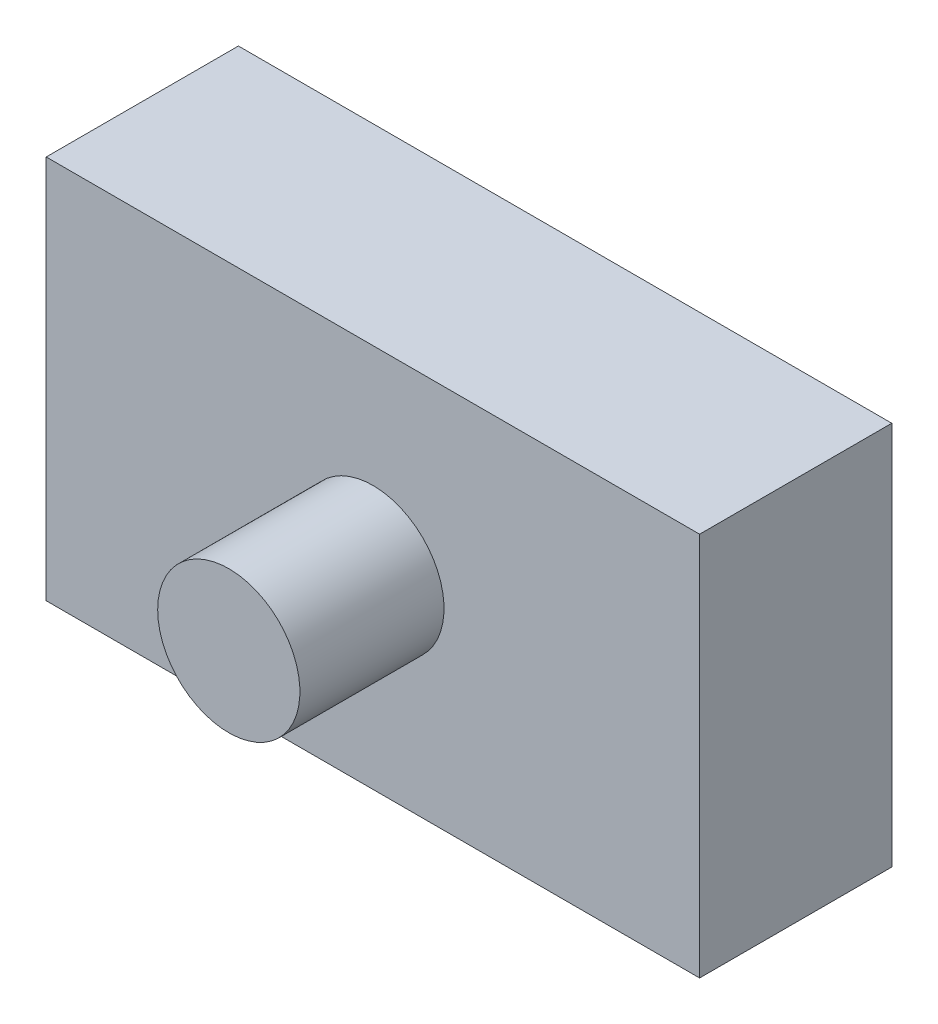
ISO-10303-21;
HEADER;
FILE_DESCRIPTION(('STEP AP214'),'2;1');
FILE_NAME('part.step','',(''),(''),'','','');
FILE_SCHEMA(('AUTOMOTIVE_DESIGN { 1 0 10303 214 1 1 1 1 }'));
ENDSEC;
DATA;
#1=APPLICATION_CONTEXT('core data for automotive mechanical design processes');
#2=APPLICATION_PROTOCOL_DEFINITION('international standard','automotive_design',2000,#1);
#3=PRODUCT_CONTEXT('',#1,'mechanical');
#4=PRODUCT('Part','Part','',(#3));
#5=PRODUCT_RELATED_PRODUCT_CATEGORY('part','',(#4));
#6=PRODUCT_DEFINITION_FORMATION('','',#4);
#7=PRODUCT_DEFINITION_CONTEXT('part definition',#1,'design');
#8=PRODUCT_DEFINITION('design','',#6,#7);
#9=PRODUCT_DEFINITION_SHAPE('','',#8);
#10=(LENGTH_UNIT() NAMED_UNIT(*) SI_UNIT(.MILLI.,.METRE.));
#11=(NAMED_UNIT(*) PLANE_ANGLE_UNIT() SI_UNIT($,.RADIAN.));
#12=(NAMED_UNIT(*) SI_UNIT($,.STERADIAN.) SOLID_ANGLE_UNIT());
#13=UNCERTAINTY_MEASURE_WITH_UNIT(LENGTH_MEASURE(1.E-05),#10,'distance_accuracy_value','');
#14=(GEOMETRIC_REPRESENTATION_CONTEXT(3) GLOBAL_UNCERTAINTY_ASSIGNED_CONTEXT((#13)) GLOBAL_UNIT_ASSIGNED_CONTEXT((#10,
#11,#12)) REPRESENTATION_CONTEXT('',''));
#15=CARTESIAN_POINT('',(0.,0.,0.));
#16=DIRECTION('',(0.,0.,1.));
#17=DIRECTION('',(1.,0.,0.));
#18=AXIS2_PLACEMENT_3D('',#15,#16,#17);
#19=CARTESIAN_POINT('',(21.59,-12.7,-12.7));
#20=DIRECTION('',(1.,0.,0.));
#21=DIRECTION('',(0.,0.,-1.));
#22=AXIS2_PLACEMENT_3D('',#19,#20,#21);
#23=PLANE('',#22);
#24=DIRECTION('',(0.,1.,0.));
#25=VECTOR('',#24,1.);
#26=CARTESIAN_POINT('',(21.59,-12.7,0.));
#27=LINE('',#26,#25);
#28=CARTESIAN_POINT('',(21.59,-12.7,0.));
#29=VERTEX_POINT('',#28);
#30=CARTESIAN_POINT('',(21.59,12.7,0.));
#31=VERTEX_POINT('',#30);
#32=EDGE_CURVE('E111',#29,#31,#27,.T.);
#33=ORIENTED_EDGE('',*,*,#32,.F.);
#34=DIRECTION('',(0.,0.,1.));
#35=VECTOR('',#34,1.);
#36=CARTESIAN_POINT('',(21.59,-12.7,-12.7));
#37=LINE('',#36,#35);
#38=CARTESIAN_POINT('',(21.59,-12.7,-12.7));
#39=VERTEX_POINT('',#38);
#40=EDGE_CURVE('E49',#39,#29,#37,.T.);
#41=ORIENTED_EDGE('',*,*,#40,.F.);
#42=DIRECTION('',(0.,1.,0.));
#43=VECTOR('',#42,1.);
#44=CARTESIAN_POINT('',(21.59,-12.7,-12.7));
#45=LINE('',#44,#43);
#46=CARTESIAN_POINT('',(21.59,12.7,-12.7));
#47=VERTEX_POINT('',#46);
#48=EDGE_CURVE('E103',#39,#47,#45,.T.);
#49=ORIENTED_EDGE('',*,*,#48,.T.);
#50=DIRECTION('',(0.,0.,1.));
#51=VECTOR('',#50,1.);
#52=CARTESIAN_POINT('',(21.59,12.7,-12.7));
#53=LINE('',#52,#51);
#54=EDGE_CURVE('E42',#47,#31,#53,.T.);
#55=ORIENTED_EDGE('',*,*,#54,.T.);
#56=EDGE_LOOP('',(#33,#41,#49,#55));
#57=FACE_BOUND('',#56,.T.);
#58=ADVANCED_FACE('F39',(#57),#23,.T.);
#59=CARTESIAN_POINT('',(-21.59,-12.7,-12.7));
#60=DIRECTION('',(0.,-1.,0.));
#61=DIRECTION('',(0.,0.,-1.));
#62=AXIS2_PLACEMENT_3D('',#59,#60,#61);
#63=PLANE('',#62);
#64=DIRECTION('',(1.,0.,0.));
#65=VECTOR('',#64,1.);
#66=CARTESIAN_POINT('',(-21.59,-12.7,0.));
#67=LINE('',#66,#65);
#68=CARTESIAN_POINT('',(-21.59,-12.7,0.));
#69=VERTEX_POINT('',#68);
#70=EDGE_CURVE('E106',#69,#29,#67,.T.);
#71=ORIENTED_EDGE('',*,*,#70,.F.);
#72=DIRECTION('',(0.,0.,1.));
#73=VECTOR('',#72,1.);
#74=CARTESIAN_POINT('',(-21.59,-12.7,-12.7));
#75=LINE('',#74,#73);
#76=CARTESIAN_POINT('',(-21.59,-12.7,-12.7));
#77=VERTEX_POINT('',#76);
#78=EDGE_CURVE('E74',#77,#69,#75,.T.);
#79=ORIENTED_EDGE('',*,*,#78,.F.);
#80=DIRECTION('',(1.,0.,0.));
#81=VECTOR('',#80,1.);
#82=CARTESIAN_POINT('',(-21.59,-12.7,-12.7));
#83=LINE('',#82,#81);
#84=EDGE_CURVE('E98',#77,#39,#83,.T.);
#85=ORIENTED_EDGE('',*,*,#84,.T.);
#86=ORIENTED_EDGE('',*,*,#40,.T.);
#87=EDGE_LOOP('',(#71,#79,#85,#86));
#88=FACE_BOUND('',#87,.T.);
#89=ADVANCED_FACE('F130',(#88),#63,.T.);
#90=CARTESIAN_POINT('',(-21.59,-12.7,-12.7));
#91=DIRECTION('',(-1.,0.,0.));
#92=DIRECTION('',(0.,0.,1.));
#93=AXIS2_PLACEMENT_3D('',#90,#91,#92);
#94=PLANE('',#93);
#95=DIRECTION('',(0.,-1.,0.));
#96=VECTOR('',#95,1.);
#97=CARTESIAN_POINT('',(-21.59,-12.7,0.));
#98=LINE('',#97,#96);
#99=CARTESIAN_POINT('',(-21.59,12.7,0.));
#100=VERTEX_POINT('',#99);
#101=EDGE_CURVE('E92',#100,#69,#98,.T.);
#102=ORIENTED_EDGE('',*,*,#101,.F.);
#103=DIRECTION('',(0.,0.,1.));
#104=VECTOR('',#103,1.);
#105=CARTESIAN_POINT('',(-21.59,12.7,-12.7));
#106=LINE('',#105,#104);
#107=CARTESIAN_POINT('',(-21.59,12.7,-12.7));
#108=VERTEX_POINT('',#107);
#109=EDGE_CURVE('E87',#108,#100,#106,.T.);
#110=ORIENTED_EDGE('',*,*,#109,.F.);
#111=DIRECTION('',(0.,-1.,0.));
#112=VECTOR('',#111,1.);
#113=CARTESIAN_POINT('',(-21.59,-12.7,-12.7));
#114=LINE('',#113,#112);
#115=EDGE_CURVE('E90',#108,#77,#114,.T.);
#116=ORIENTED_EDGE('',*,*,#115,.T.);
#117=ORIENTED_EDGE('',*,*,#78,.T.);
#118=EDGE_LOOP('',(#102,#110,#116,#117));
#119=FACE_BOUND('',#118,.T.);
#120=ADVANCED_FACE('F89',(#119),#94,.T.);
#121=CARTESIAN_POINT('',(-21.59,12.7,-12.7));
#122=DIRECTION('',(0.,1.,0.));
#123=DIRECTION('',(0.,0.,1.));
#124=AXIS2_PLACEMENT_3D('',#121,#122,#123);
#125=PLANE('',#124);
#126=DIRECTION('',(-1.,0.,0.));
#127=VECTOR('',#126,1.);
#128=CARTESIAN_POINT('',(-21.59,12.7,0.));
#129=LINE('',#128,#127);
#130=EDGE_CURVE('E115',#31,#100,#129,.T.);
#131=ORIENTED_EDGE('',*,*,#130,.F.);
#132=ORIENTED_EDGE('',*,*,#54,.F.);
#133=DIRECTION('',(-1.,0.,0.));
#134=VECTOR('',#133,1.);
#135=CARTESIAN_POINT('',(-21.59,12.7,-12.7));
#136=LINE('',#135,#134);
#137=EDGE_CURVE('E97',#47,#108,#136,.T.);
#138=ORIENTED_EDGE('',*,*,#137,.T.);
#139=ORIENTED_EDGE('',*,*,#109,.T.);
#140=EDGE_LOOP('',(#131,#132,#138,#139));
#141=FACE_BOUND('',#140,.T.);
#142=ADVANCED_FACE('F101',(#141),#125,.T.);
#143=CARTESIAN_POINT('',(0.,0.,-12.7));
#144=DIRECTION('',(0.,0.,-1.));
#145=DIRECTION('',(-1.,0.,0.));
#146=AXIS2_PLACEMENT_3D('',#143,#144,#145);
#147=PLANE('',#146);
#148=ORIENTED_EDGE('',*,*,#48,.F.);
#149=ORIENTED_EDGE('',*,*,#84,.F.);
#150=ORIENTED_EDGE('',*,*,#115,.F.);
#151=ORIENTED_EDGE('',*,*,#137,.F.);
#152=EDGE_LOOP('',(#148,#149,#150,#151));
#153=FACE_BOUND('',#152,.T.);
#154=ADVANCED_FACE('F96',(#153),#147,.T.);
#155=CARTESIAN_POINT('',(0.,0.,0.));
#156=DIRECTION('',(0.,0.,-1.));
#157=DIRECTION('',(-1.,0.,0.));
#158=AXIS2_PLACEMENT_3D('',#155,#156,#157);
#159=PLANE('',#158);
#160=CARTESIAN_POINT('',(0.,0.,0.));
#161=DIRECTION('',(0.,0.,1.));
#162=DIRECTION('',(1.,0.,0.));
#163=AXIS2_PLACEMENT_3D('',#160,#161,#162);
#164=CIRCLE('',#163,4.699);
#165=CARTESIAN_POINT('',(-4.699,0.,0.));
#166=VERTEX_POINT('',#165);
#167=EDGE_CURVE('E11',#166,#166,#164,.T.);
#168=ORIENTED_EDGE('',*,*,#167,.F.);
#169=EDGE_LOOP('',(#168));
#170=FACE_BOUND('',#169,.T.);
#171=ORIENTED_EDGE('',*,*,#32,.T.);
#172=ORIENTED_EDGE('',*,*,#130,.T.);
#173=ORIENTED_EDGE('',*,*,#101,.T.);
#174=ORIENTED_EDGE('',*,*,#70,.T.);
#175=EDGE_LOOP('',(#171,#172,#173,#174));
#176=FACE_BOUND('',#175,.T.);
#177=ADVANCED_FACE('F129',(#170,#176),#159,.F.);
#178=CARTESIAN_POINT('',(0.,0.,9.525));
#179=DIRECTION('',(0.,0.,-1.));
#180=DIRECTION('',(-1.,0.,0.));
#181=AXIS2_PLACEMENT_3D('',#178,#179,#180);
#182=CYLINDRICAL_SURFACE('',#181,4.699);
#183=CARTESIAN_POINT('',(0.,0.,9.525));
#184=DIRECTION('',(0.,0.,1.));
#185=DIRECTION('',(1.,0.,0.));
#186=AXIS2_PLACEMENT_3D('',#183,#184,#185);
#187=CIRCLE('',#186,4.699);
#188=CARTESIAN_POINT('',(-4.699,0.,9.525));
#189=VERTEX_POINT('',#188);
#190=EDGE_CURVE('E116',#189,#189,#187,.T.);
#191=CARTESIAN_POINT('',(-4.699,0.,9.525));
#192=CARTESIAN_POINT('',(-4.699,0.,9.42578125));
#193=CARTESIAN_POINT('',(-4.699,0.,9.3265625));
#194=CARTESIAN_POINT('',(-4.699,0.,9.128125));
#195=CARTESIAN_POINT('',(-4.699,0.,9.02890625));
#196=CARTESIAN_POINT('',(-4.699,0.,8.83046875));
#197=CARTESIAN_POINT('',(-4.699,0.,8.73125));
#198=CARTESIAN_POINT('',(-4.699,0.,8.5328125));
#199=CARTESIAN_POINT('',(-4.699,0.,8.43359375));
#200=CARTESIAN_POINT('',(-4.699,0.,8.23515625));
#201=CARTESIAN_POINT('',(-4.699,0.,8.1359375));
#202=CARTESIAN_POINT('',(-4.699,0.,7.9375));
#203=CARTESIAN_POINT('',(-4.699,0.,7.83828125));
#204=CARTESIAN_POINT('',(-4.699,0.,7.63984375));
#205=CARTESIAN_POINT('',(-4.699,0.,7.540625));
#206=CARTESIAN_POINT('',(-4.699,0.,7.3421875));
#207=CARTESIAN_POINT('',(-4.699,0.,7.24296875));
#208=CARTESIAN_POINT('',(-4.699,0.,7.04453125));
#209=CARTESIAN_POINT('',(-4.699,0.,6.9453125));
#210=CARTESIAN_POINT('',(-4.699,0.,6.746875));
#211=CARTESIAN_POINT('',(-4.699,0.,6.64765625));
#212=CARTESIAN_POINT('',(-4.699,0.,6.44921875));
#213=CARTESIAN_POINT('',(-4.699,0.,6.35));
#214=CARTESIAN_POINT('',(-4.699,0.,6.1515625));
#215=CARTESIAN_POINT('',(-4.699,0.,6.05234375));
#216=CARTESIAN_POINT('',(-4.699,0.,5.85390625));
#217=CARTESIAN_POINT('',(-4.699,0.,5.7546875));
#218=CARTESIAN_POINT('',(-4.699,0.,5.55625));
#219=CARTESIAN_POINT('',(-4.699,0.,5.45703125));
#220=CARTESIAN_POINT('',(-4.699,0.,5.25859375));
#221=CARTESIAN_POINT('',(-4.699,0.,5.159375));
#222=CARTESIAN_POINT('',(-4.699,0.,4.9609375));
#223=CARTESIAN_POINT('',(-4.699,0.,4.86171875));
#224=CARTESIAN_POINT('',(-4.699,0.,4.66328125));
#225=CARTESIAN_POINT('',(-4.699,0.,4.5640625));
#226=CARTESIAN_POINT('',(-4.699,0.,4.365625));
#227=CARTESIAN_POINT('',(-4.699,0.,4.26640625));
#228=CARTESIAN_POINT('',(-4.699,0.,4.06796875));
#229=CARTESIAN_POINT('',(-4.699,0.,3.96875));
#230=CARTESIAN_POINT('',(-4.699,0.,3.7703125));
#231=CARTESIAN_POINT('',(-4.699,0.,3.67109375));
#232=CARTESIAN_POINT('',(-4.699,0.,3.47265625));
#233=CARTESIAN_POINT('',(-4.699,0.,3.3734375));
#234=CARTESIAN_POINT('',(-4.699,0.,3.175));
#235=CARTESIAN_POINT('',(-4.699,0.,3.07578125));
#236=CARTESIAN_POINT('',(-4.699,0.,2.87734375));
#237=CARTESIAN_POINT('',(-4.699,0.,2.778125));
#238=CARTESIAN_POINT('',(-4.699,0.,2.5796875));
#239=CARTESIAN_POINT('',(-4.699,0.,2.48046875));
#240=CARTESIAN_POINT('',(-4.699,0.,2.28203125));
#241=CARTESIAN_POINT('',(-4.699,0.,2.1828125));
#242=CARTESIAN_POINT('',(-4.699,0.,1.984375));
#243=CARTESIAN_POINT('',(-4.699,0.,1.88515625));
#244=CARTESIAN_POINT('',(-4.699,0.,1.68671875));
#245=CARTESIAN_POINT('',(-4.699,0.,1.5875));
#246=CARTESIAN_POINT('',(-4.699,0.,1.3890625));
#247=CARTESIAN_POINT('',(-4.699,0.,1.28984375));
#248=CARTESIAN_POINT('',(-4.699,0.,1.09140625));
#249=CARTESIAN_POINT('',(-4.699,0.,0.992187500000001));
#250=CARTESIAN_POINT('',(-4.699,0.,0.793750000000001));
#251=CARTESIAN_POINT('',(-4.699,0.,0.69453125));
#252=CARTESIAN_POINT('',(-4.699,0.,0.49609375));
#253=CARTESIAN_POINT('',(-4.699,0.,0.396875));
#254=CARTESIAN_POINT('',(-4.699,0.,0.1984375));
#255=CARTESIAN_POINT('',(-4.699,0.,0.0992187500000001));
#256=CARTESIAN_POINT('',(-4.699,0.,0.));
#257=B_SPLINE_CURVE_WITH_KNOTS('',3,(#191,#192,#193,#194,#195,#196,#197,#198,#199,#200,#201,
#202,#203,#204,#205,#206,#207,#208,#209,#210,#211,#212,#213,#214,#215,#216,#217,#218,#219,#220,
#221,#222,#223,#224,#225,#226,#227,#228,#229,#230,#231,#232,#233,#234,#235,#236,#237,#238,#239,
#240,#241,#242,#243,#244,#245,#246,#247,#248,#249,#250,#251,#252,#253,#254,#255,#256),
.UNSPECIFIED.,.F.,.F.,(4,2,2,2,2,2,2,2,2,2,2,2,2,2,2,2,2,2,2,2,2,2,2,2,2,2,2,2,2,2,2,2,4),(0.,
0.29765625,0.5953125,0.892968750000001,1.190625,1.48828125,1.7859375,2.08359375,2.38125,
2.67890625,2.9765625,3.27421875,3.571875,3.86953125,4.1671875,4.46484375,4.7625,5.06015625,
5.3578125,5.65546875,5.953125,6.25078125,6.5484375,6.84609375,7.14375,7.44140625,7.7390625,
8.03671875,8.334375,8.63203125,8.9296875,9.22734375,9.525),.UNSPECIFIED.);
#258=EDGE_CURVE('BSEAM147',#189,#166,#257,.T.);
#259=ORIENTED_EDGE('',*,*,#190,.F.);
#260=ORIENTED_EDGE('',*,*,#167,.T.);
#261=ORIENTED_EDGE('',*,*,#258,.T.);
#262=ORIENTED_EDGE('',*,*,#258,.F.);
#263=EDGE_LOOP('',(#259,#261,#260,#262));
#264=FACE_BOUND('',#263,.T.);
#265=ADVANCED_FACE('F147',(#264),#182,.T.);
#266=CARTESIAN_POINT('',(0.,0.,9.525));
#267=DIRECTION('',(0.,0.,1.));
#268=DIRECTION('',(1.,0.,0.));
#269=AXIS2_PLACEMENT_3D('',#266,#267,#268);
#270=PLANE('',#269);
#271=ORIENTED_EDGE('',*,*,#190,.T.);
#272=EDGE_LOOP('',(#271));
#273=FACE_BOUND('',#272,.T.);
#274=ADVANCED_FACE('F152',(#273),#270,.T.);
#275=CLOSED_SHELL('',(#58,#89,#120,#142,#154,#177,#265,#274));
#276=MANIFOLD_SOLID_BREP('B2',#275);
#277=ADVANCED_BREP_SHAPE_REPRESENTATION('',(#18,#276),#14);
#278=SHAPE_DEFINITION_REPRESENTATION(#9,#277);
ENDSEC;
END-ISO-10303-21;
